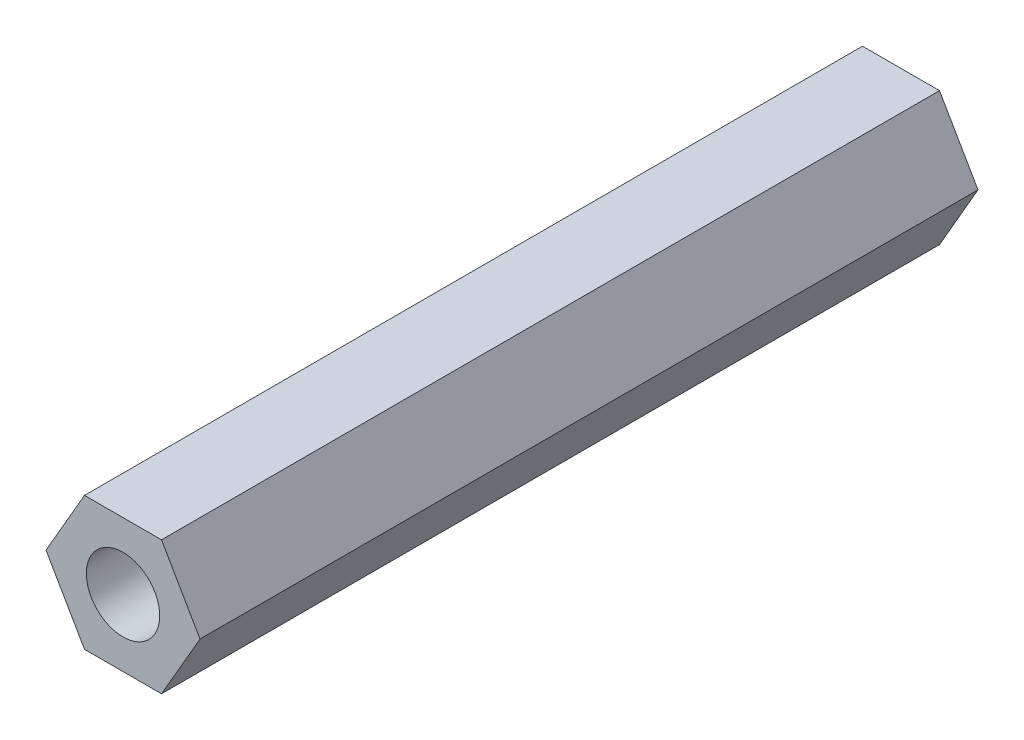
ISO-10303-21;
HEADER;
FILE_DESCRIPTION(('STEP AP214'),'2;1');
FILE_NAME('part.step','',(''),(''),'','','');
FILE_SCHEMA(('AUTOMOTIVE_DESIGN { 1 0 10303 214 1 1 1 1 }'));
ENDSEC;
DATA;
#1=APPLICATION_CONTEXT('core data for automotive mechanical design processes');
#2=APPLICATION_PROTOCOL_DEFINITION('international standard','automotive_design',2000,#1);
#3=PRODUCT_CONTEXT('',#1,'mechanical');
#4=PRODUCT('Part','Part','',(#3));
#5=PRODUCT_RELATED_PRODUCT_CATEGORY('part','',(#4));
#6=PRODUCT_DEFINITION_FORMATION('','',#4);
#7=PRODUCT_DEFINITION_CONTEXT('part definition',#1,'design');
#8=PRODUCT_DEFINITION('design','',#6,#7);
#9=PRODUCT_DEFINITION_SHAPE('','',#8);
#10=(LENGTH_UNIT() NAMED_UNIT(*) SI_UNIT(.MILLI.,.METRE.));
#11=(NAMED_UNIT(*) PLANE_ANGLE_UNIT() SI_UNIT($,.RADIAN.));
#12=(NAMED_UNIT(*) SI_UNIT($,.STERADIAN.) SOLID_ANGLE_UNIT());
#13=UNCERTAINTY_MEASURE_WITH_UNIT(LENGTH_MEASURE(1.E-05),#10,'distance_accuracy_value','');
#14=(GEOMETRIC_REPRESENTATION_CONTEXT(3) GLOBAL_UNCERTAINTY_ASSIGNED_CONTEXT((#13)) GLOBAL_UNIT_ASSIGNED_CONTEXT((#10,
#11,#12)) REPRESENTATION_CONTEXT('',''));
#15=CARTESIAN_POINT('',(0.,0.,0.));
#16=DIRECTION('',(0.,0.,1.));
#17=DIRECTION('',(1.,0.,0.));
#18=AXIS2_PLACEMENT_3D('',#15,#16,#17);
#19=CARTESIAN_POINT('',(-1.73205080756888,-3.,35.));
#20=DIRECTION('',(0.866025403784439,-0.5,0.));
#21=DIRECTION('',(0.5,0.866025403784439,0.));
#22=AXIS2_PLACEMENT_3D('',#19,#20,#21);
#23=PLANE('',#22);
#24=DIRECTION('',(0.,0.,1.));
#25=VECTOR('',#24,1.);
#26=CARTESIAN_POINT('',(-1.73205080756888,-3.,35.));
#27=LINE('',#26,#25);
#28=CARTESIAN_POINT('',(-1.73205080756888,-3.,0.));
#29=VERTEX_POINT('',#28);
#30=CARTESIAN_POINT('',(-1.73205080756888,-3.,35.));
#31=VERTEX_POINT('',#30);
#32=EDGE_CURVE('E96',#29,#31,#27,.T.);
#33=ORIENTED_EDGE('',*,*,#32,.T.);
#34=DIRECTION('',(0.5,0.866025403784439,0.));
#35=VECTOR('',#34,1.);
#36=CARTESIAN_POINT('',(-1.73205080756888,-3.,35.));
#37=LINE('',#36,#35);
#38=CARTESIAN_POINT('',(0.,0.,35.));
#39=VERTEX_POINT('',#38);
#40=EDGE_CURVE('E108',#31,#39,#37,.T.);
#41=ORIENTED_EDGE('',*,*,#40,.T.);
#42=DIRECTION('',(0.,0.,1.));
#43=VECTOR('',#42,1.);
#44=CARTESIAN_POINT('',(0.,0.,35.));
#45=LINE('',#44,#43);
#46=CARTESIAN_POINT('',(0.,0.,0.));
#47=VERTEX_POINT('',#46);
#48=EDGE_CURVE('E66',#39,#47,#45,.F.);
#49=ORIENTED_EDGE('',*,*,#48,.T.);
#50=DIRECTION('',(0.5,0.866025403784439,0.));
#51=VECTOR('',#50,1.);
#52=CARTESIAN_POINT('',(-1.73205080756888,-3.,0.));
#53=LINE('',#52,#51);
#54=EDGE_CURVE('E107',#29,#47,#53,.T.);
#55=ORIENTED_EDGE('',*,*,#54,.F.);
#56=EDGE_LOOP('',(#33,#41,#49,#55));
#57=FACE_BOUND('',#56,.T.);
#58=ADVANCED_FACE('F17',(#57),#23,.F.);
#59=CARTESIAN_POINT('',(0.,0.,35.));
#60=DIRECTION('',(0.,-1.,0.));
#61=DIRECTION('',(1.,0.,0.));
#62=AXIS2_PLACEMENT_3D('',#59,#60,#61);
#63=PLANE('',#62);
#64=ORIENTED_EDGE('',*,*,#48,.F.);
#65=DIRECTION('',(-1.,0.,0.));
#66=VECTOR('',#65,1.);
#67=CARTESIAN_POINT('',(0.,0.,35.));
#68=LINE('',#67,#66);
#69=CARTESIAN_POINT('',(3.46410161513775,0.,35.));
#70=VERTEX_POINT('',#69);
#71=EDGE_CURVE('E87',#39,#70,#68,.F.);
#72=ORIENTED_EDGE('',*,*,#71,.T.);
#73=DIRECTION('',(0.,0.,1.));
#74=VECTOR('',#73,1.);
#75=CARTESIAN_POINT('',(3.46410161513775,0.,35.));
#76=LINE('',#75,#74);
#77=CARTESIAN_POINT('',(3.46410161513775,0.,0.));
#78=VERTEX_POINT('',#77);
#79=EDGE_CURVE('E73',#70,#78,#76,.F.);
#80=ORIENTED_EDGE('',*,*,#79,.T.);
#81=DIRECTION('',(-1.,0.,0.));
#82=VECTOR('',#81,1.);
#83=CARTESIAN_POINT('',(0.,0.,0.));
#84=LINE('',#83,#82);
#85=EDGE_CURVE('E109',#47,#78,#84,.F.);
#86=ORIENTED_EDGE('',*,*,#85,.F.);
#87=EDGE_LOOP('',(#64,#72,#80,#86));
#88=FACE_BOUND('',#87,.T.);
#89=ADVANCED_FACE('F93',(#88),#63,.F.);
#90=CARTESIAN_POINT('',(3.46410161513775,0.,35.));
#91=DIRECTION('',(-0.866025403784439,-0.5,0.));
#92=DIRECTION('',(0.5,-0.866025403784439,0.));
#93=AXIS2_PLACEMENT_3D('',#90,#91,#92);
#94=PLANE('',#93);
#95=ORIENTED_EDGE('',*,*,#79,.F.);
#96=DIRECTION('',(0.5,-0.866025403784439,0.));
#97=VECTOR('',#96,1.);
#98=CARTESIAN_POINT('',(3.46410161513775,0.,35.));
#99=LINE('',#98,#97);
#100=CARTESIAN_POINT('',(5.19615242270663,-3.,35.));
#101=VERTEX_POINT('',#100);
#102=EDGE_CURVE('E77',#70,#101,#99,.T.);
#103=ORIENTED_EDGE('',*,*,#102,.T.);
#104=DIRECTION('',(0.,0.,1.));
#105=VECTOR('',#104,1.);
#106=CARTESIAN_POINT('',(5.19615242270663,-3.,35.));
#107=LINE('',#106,#105);
#108=CARTESIAN_POINT('',(5.19615242270663,-3.,0.));
#109=VERTEX_POINT('',#108);
#110=EDGE_CURVE('E79',#101,#109,#107,.F.);
#111=ORIENTED_EDGE('',*,*,#110,.T.);
#112=DIRECTION('',(0.5,-0.866025403784439,0.));
#113=VECTOR('',#112,1.);
#114=CARTESIAN_POINT('',(3.46410161513775,0.,0.));
#115=LINE('',#114,#113);
#116=EDGE_CURVE('E78',#78,#109,#115,.T.);
#117=ORIENTED_EDGE('',*,*,#116,.F.);
#118=EDGE_LOOP('',(#95,#103,#111,#117));
#119=FACE_BOUND('',#118,.T.);
#120=ADVANCED_FACE('F75',(#119),#94,.F.);
#121=CARTESIAN_POINT('',(5.19615242270663,-3.,35.));
#122=DIRECTION('',(-0.866025403784439,0.5,0.));
#123=DIRECTION('',(-0.5,-0.866025403784439,0.));
#124=AXIS2_PLACEMENT_3D('',#121,#122,#123);
#125=PLANE('',#124);
#126=ORIENTED_EDGE('',*,*,#110,.F.);
#127=DIRECTION('',(-0.5,-0.866025403784439,0.));
#128=VECTOR('',#127,1.);
#129=CARTESIAN_POINT('',(5.19615242270663,-3.,35.));
#130=LINE('',#129,#128);
#131=CARTESIAN_POINT('',(3.46410161513775,-6.,35.));
#132=VERTEX_POINT('',#131);
#133=EDGE_CURVE('E91',#101,#132,#130,.T.);
#134=ORIENTED_EDGE('',*,*,#133,.T.);
#135=DIRECTION('',(0.,0.,1.));
#136=VECTOR('',#135,1.);
#137=CARTESIAN_POINT('',(3.46410161513775,-6.,35.));
#138=LINE('',#137,#136);
#139=CARTESIAN_POINT('',(3.46410161513775,-6.,0.));
#140=VERTEX_POINT('',#139);
#141=EDGE_CURVE('E101',#132,#140,#138,.F.);
#142=ORIENTED_EDGE('',*,*,#141,.T.);
#143=DIRECTION('',(-0.5,-0.866025403784439,0.));
#144=VECTOR('',#143,1.);
#145=CARTESIAN_POINT('',(5.19615242270663,-3.,0.));
#146=LINE('',#145,#144);
#147=EDGE_CURVE('E111',#109,#140,#146,.T.);
#148=ORIENTED_EDGE('',*,*,#147,.F.);
#149=EDGE_LOOP('',(#126,#134,#142,#148));
#150=FACE_BOUND('',#149,.T.);
#151=ADVANCED_FACE('F123',(#150),#125,.F.);
#152=CARTESIAN_POINT('',(3.46410161513775,-6.,35.));
#153=DIRECTION('',(0.,1.,0.));
#154=DIRECTION('',(0.,0.,1.));
#155=AXIS2_PLACEMENT_3D('',#152,#153,#154);
#156=PLANE('',#155);
#157=ORIENTED_EDGE('',*,*,#141,.F.);
#158=DIRECTION('',(-1.,0.,0.));
#159=VECTOR('',#158,1.);
#160=CARTESIAN_POINT('',(0.,-6.,35.));
#161=LINE('',#160,#159);
#162=CARTESIAN_POINT('',(0.,-6.,35.));
#163=VERTEX_POINT('',#162);
#164=EDGE_CURVE('E120',#132,#163,#161,.T.);
#165=ORIENTED_EDGE('',*,*,#164,.T.);
#166=DIRECTION('',(0.,0.,1.));
#167=VECTOR('',#166,1.);
#168=CARTESIAN_POINT('',(0.,-6.,35.));
#169=LINE('',#168,#167);
#170=CARTESIAN_POINT('',(0.,-6.,0.));
#171=VERTEX_POINT('',#170);
#172=EDGE_CURVE('E94',#163,#171,#169,.F.);
#173=ORIENTED_EDGE('',*,*,#172,.T.);
#174=DIRECTION('',(-1.,0.,0.));
#175=VECTOR('',#174,1.);
#176=CARTESIAN_POINT('',(0.,-6.,0.));
#177=LINE('',#176,#175);
#178=EDGE_CURVE('E33',#140,#171,#177,.T.);
#179=ORIENTED_EDGE('',*,*,#178,.F.);
#180=EDGE_LOOP('',(#157,#165,#173,#179));
#181=FACE_BOUND('',#180,.T.);
#182=ADVANCED_FACE('F150',(#181),#156,.F.);
#183=CARTESIAN_POINT('',(0.,-6.,35.));
#184=DIRECTION('',(0.866025403784439,0.5,0.));
#185=DIRECTION('',(-0.5,0.866025403784439,0.));
#186=AXIS2_PLACEMENT_3D('',#183,#184,#185);
#187=PLANE('',#186);
#188=ORIENTED_EDGE('',*,*,#172,.F.);
#189=DIRECTION('',(-0.5,0.866025403784439,0.));
#190=VECTOR('',#189,1.);
#191=CARTESIAN_POINT('',(0.,-6.,35.));
#192=LINE('',#191,#190);
#193=EDGE_CURVE('E117',#163,#31,#192,.T.);
#194=ORIENTED_EDGE('',*,*,#193,.T.);
#195=ORIENTED_EDGE('',*,*,#32,.F.);
#196=DIRECTION('',(-0.5,0.866025403784439,0.));
#197=VECTOR('',#196,1.);
#198=CARTESIAN_POINT('',(0.,-6.,0.));
#199=LINE('',#198,#197);
#200=EDGE_CURVE('E125',#171,#29,#199,.T.);
#201=ORIENTED_EDGE('',*,*,#200,.F.);
#202=EDGE_LOOP('',(#188,#194,#195,#201));
#203=FACE_BOUND('',#202,.T.);
#204=ADVANCED_FACE('F145',(#203),#187,.F.);
#205=CARTESIAN_POINT('',(0.,0.,35.));
#206=DIRECTION('',(0.,0.,-1.));
#207=DIRECTION('',(-1.,0.,0.));
#208=AXIS2_PLACEMENT_3D('',#205,#206,#207);
#209=PLANE('',#208);
#210=ORIENTED_EDGE('',*,*,#193,.F.);
#211=ORIENTED_EDGE('',*,*,#164,.F.);
#212=ORIENTED_EDGE('',*,*,#133,.F.);
#213=ORIENTED_EDGE('',*,*,#102,.F.);
#214=ORIENTED_EDGE('',*,*,#71,.F.);
#215=ORIENTED_EDGE('',*,*,#40,.F.);
#216=EDGE_LOOP('',(#210,#211,#212,#213,#214,#215));
#217=FACE_BOUND('',#216,.T.);
#218=CARTESIAN_POINT('',(1.73205080756888,-3.,35.));
#219=DIRECTION('',(0.,0.,1.));
#220=DIRECTION('',(1.,0.,0.));
#221=AXIS2_PLACEMENT_3D('',#218,#219,#220);
#222=CIRCLE('',#221,1.64999999999999);
#223=CARTESIAN_POINT('',(3.38205080756887,-3.,35.));
#224=VERTEX_POINT('',#223);
#225=EDGE_CURVE('E20',#224,#224,#222,.F.);
#226=ORIENTED_EDGE('',*,*,#225,.T.);
#227=EDGE_LOOP('',(#226));
#228=FACE_BOUND('',#227,.T.);
#229=ADVANCED_FACE('F84',(#217,#228),#209,.F.);
#230=CARTESIAN_POINT('',(0.,0.,0.));
#231=DIRECTION('',(0.,0.,-1.));
#232=DIRECTION('',(-1.,0.,0.));
#233=AXIS2_PLACEMENT_3D('',#230,#231,#232);
#234=PLANE('',#233);
#235=ORIENTED_EDGE('',*,*,#178,.T.);
#236=ORIENTED_EDGE('',*,*,#200,.T.);
#237=ORIENTED_EDGE('',*,*,#54,.T.);
#238=ORIENTED_EDGE('',*,*,#85,.T.);
#239=ORIENTED_EDGE('',*,*,#116,.T.);
#240=ORIENTED_EDGE('',*,*,#147,.T.);
#241=EDGE_LOOP('',(#235,#236,#237,#238,#239,#240));
#242=FACE_BOUND('',#241,.T.);
#243=CARTESIAN_POINT('',(1.73205080756888,-3.,0.));
#244=DIRECTION('',(0.,0.,1.));
#245=DIRECTION('',(1.,0.,0.));
#246=AXIS2_PLACEMENT_3D('',#243,#244,#245);
#247=CIRCLE('',#246,1.64999999999999);
#248=CARTESIAN_POINT('',(3.38205080756887,-3.,0.));
#249=VERTEX_POINT('',#248);
#250=EDGE_CURVE('E11',#249,#249,#247,.T.);
#251=ORIENTED_EDGE('',*,*,#250,.T.);
#252=EDGE_LOOP('',(#251));
#253=FACE_BOUND('',#252,.T.);
#254=ADVANCED_FACE('F135',(#242,#253),#234,.T.);
#255=CARTESIAN_POINT('',(1.73205080756888,-3.,35.));
#256=DIRECTION('',(0.,0.,1.));
#257=DIRECTION('',(1.,0.,0.));
#258=AXIS2_PLACEMENT_3D('',#255,#256,#257);
#259=CYLINDRICAL_SURFACE('',#258,1.64999999999999);
#260=ORIENTED_EDGE('',*,*,#225,.F.);
#261=EDGE_LOOP('',(#260));
#262=FACE_BOUND('',#261,.T.);
#263=ORIENTED_EDGE('',*,*,#250,.F.);
#264=EDGE_LOOP('',(#263));
#265=FACE_BOUND('',#264,.T.);
#266=ADVANCED_FACE('F132',(#262,#265),#259,.F.);
#267=CLOSED_SHELL('',(#58,#89,#120,#151,#182,#204,#229,#254,#266));
#268=MANIFOLD_SOLID_BREP('B1',#267);
#269=ADVANCED_BREP_SHAPE_REPRESENTATION('',(#18,#268),#14);
#270=SHAPE_DEFINITION_REPRESENTATION(#9,#269);
ENDSEC;
END-ISO-10303-21;
